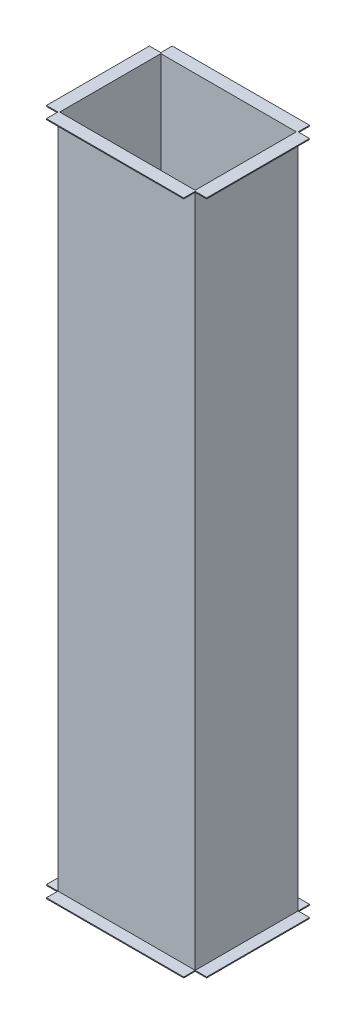
ISO-10303-21;
HEADER;
FILE_DESCRIPTION(('STEP AP214'),'2;1');
FILE_NAME('part.step','',(''),(''),'','','');
FILE_SCHEMA(('AUTOMOTIVE_DESIGN { 1 0 10303 214 1 1 1 1 }'));
ENDSEC;
DATA;
#1=APPLICATION_CONTEXT('core data for automotive mechanical design processes');
#2=APPLICATION_PROTOCOL_DEFINITION('international standard','automotive_design',2000,#1);
#3=PRODUCT_CONTEXT('',#1,'mechanical');
#4=PRODUCT('Part','Part','',(#3));
#5=PRODUCT_RELATED_PRODUCT_CATEGORY('part','',(#4));
#6=PRODUCT_DEFINITION_FORMATION('','',#4);
#7=PRODUCT_DEFINITION_CONTEXT('part definition',#1,'design');
#8=PRODUCT_DEFINITION('design','',#6,#7);
#9=PRODUCT_DEFINITION_SHAPE('','',#8);
#10=(LENGTH_UNIT() NAMED_UNIT(*) SI_UNIT(.MILLI.,.METRE.));
#11=(NAMED_UNIT(*) PLANE_ANGLE_UNIT() SI_UNIT($,.RADIAN.));
#12=(NAMED_UNIT(*) SI_UNIT($,.STERADIAN.) SOLID_ANGLE_UNIT());
#13=UNCERTAINTY_MEASURE_WITH_UNIT(LENGTH_MEASURE(1.E-05),#10,'distance_accuracy_value','');
#14=(GEOMETRIC_REPRESENTATION_CONTEXT(3) GLOBAL_UNCERTAINTY_ASSIGNED_CONTEXT((#13)) GLOBAL_UNIT_ASSIGNED_CONTEXT((#10,
#11,#12)) REPRESENTATION_CONTEXT('',''));
#15=CARTESIAN_POINT('',(0.,0.,0.));
#16=DIRECTION('',(0.,0.,1.));
#17=DIRECTION('',(1.,0.,0.));
#18=AXIS2_PLACEMENT_3D('',#15,#16,#17);
#19=CARTESIAN_POINT('',(152.4,1500.,114.3));
#20=DIRECTION('',(0.,0.,-1.));
#21=DIRECTION('',(-1.,0.,0.));
#22=AXIS2_PLACEMENT_3D('',#19,#20,#21);
#23=PLANE('',#22);
#24=DIRECTION('',(0.,-1.,0.));
#25=VECTOR('',#24,1.);
#26=CARTESIAN_POINT('',(-152.4,2.,114.3));
#27=LINE('',#26,#25);
#28=CARTESIAN_POINT('',(-152.4,2.,114.3));
#29=VERTEX_POINT('',#28);
#30=CARTESIAN_POINT('',(-152.4,0.,114.3));
#31=VERTEX_POINT('',#30);
#32=EDGE_CURVE('E322',#29,#31,#27,.T.);
#33=ORIENTED_EDGE('',*,*,#32,.F.);
#34=DIRECTION('',(-1.,0.,0.));
#35=VECTOR('',#34,1.);
#36=CARTESIAN_POINT('',(0.,2.,114.3));
#37=LINE('',#36,#35);
#38=CARTESIAN_POINT('',(-177.8,2.,114.3));
#39=VERTEX_POINT('',#38);
#40=EDGE_CURVE('E406',#29,#39,#37,.T.);
#41=ORIENTED_EDGE('',*,*,#40,.T.);
#42=DIRECTION('',(0.,-1.,0.));
#43=VECTOR('',#42,1.);
#44=CARTESIAN_POINT('',(-177.8,2.,114.3));
#45=LINE('',#44,#43);
#46=CARTESIAN_POINT('',(-177.8,0.,114.3));
#47=VERTEX_POINT('',#46);
#48=EDGE_CURVE('E413',#39,#47,#45,.T.);
#49=ORIENTED_EDGE('',*,*,#48,.T.);
#50=DIRECTION('',(1.,0.,0.));
#51=VECTOR('',#50,1.);
#52=CARTESIAN_POINT('',(152.4,0.,114.3));
#53=LINE('',#52,#51);
#54=EDGE_CURVE('E111',#47,#31,#53,.T.);
#55=ORIENTED_EDGE('',*,*,#54,.T.);
#56=EDGE_LOOP('',(#33,#41,#49,#55));
#57=FACE_BOUND('',#56,.T.);
#58=ADVANCED_FACE('F95',(#57),#23,.F.);
#59=DIRECTION('',(1.,0.,0.));
#60=VECTOR('',#59,1.);
#61=CARTESIAN_POINT('',(0.,2.,114.3));
#62=LINE('',#61,#60);
#63=CARTESIAN_POINT('',(152.4,2.,114.3));
#64=VERTEX_POINT('',#63);
#65=EDGE_CURVE('E118',#29,#64,#62,.T.);
#66=ORIENTED_EDGE('',*,*,#65,.T.);
#67=DIRECTION('',(0.,-1.,0.));
#68=VECTOR('',#67,1.);
#69=CARTESIAN_POINT('',(152.4,1500.,114.3));
#70=LINE('',#69,#68);
#71=CARTESIAN_POINT('',(152.4,1498.,114.3));
#72=VERTEX_POINT('',#71);
#73=EDGE_CURVE('E104',#72,#64,#70,.T.);
#74=ORIENTED_EDGE('',*,*,#73,.F.);
#75=DIRECTION('',(1.,0.,0.));
#76=VECTOR('',#75,1.);
#77=CARTESIAN_POINT('',(0.,1498.,114.3));
#78=LINE('',#77,#76);
#79=CARTESIAN_POINT('',(-152.4,1498.,114.3));
#80=VERTEX_POINT('',#79);
#81=EDGE_CURVE('E442',#80,#72,#78,.T.);
#82=ORIENTED_EDGE('',*,*,#81,.F.);
#83=DIRECTION('',(0.,-1.,0.));
#84=VECTOR('',#83,1.);
#85=CARTESIAN_POINT('',(-152.4,1500.,114.3));
#86=LINE('',#85,#84);
#87=EDGE_CURVE('E12',#80,#29,#86,.T.);
#88=ORIENTED_EDGE('',*,*,#87,.T.);
#89=EDGE_LOOP('',(#66,#74,#82,#88));
#90=FACE_BOUND('',#89,.T.);
#91=ADVANCED_FACE('F741',(#90),#23,.F.);
#92=CARTESIAN_POINT('',(152.4,1500.,-114.3));
#93=DIRECTION('',(-1.,0.,0.));
#94=DIRECTION('',(0.,0.,1.));
#95=AXIS2_PLACEMENT_3D('',#92,#93,#94);
#96=PLANE('',#95);
#97=DIRECTION('',(0.,0.,-1.));
#98=VECTOR('',#97,1.);
#99=CARTESIAN_POINT('',(152.4,2.,0.));
#100=LINE('',#99,#98);
#101=CARTESIAN_POINT('',(152.4,2.,-114.3));
#102=VERTEX_POINT('',#101);
#103=EDGE_CURVE('E342',#64,#102,#100,.T.);
#104=ORIENTED_EDGE('',*,*,#103,.T.);
#105=DIRECTION('',(0.,-1.,0.));
#106=VECTOR('',#105,1.);
#107=CARTESIAN_POINT('',(152.4,1500.,-114.3));
#108=LINE('',#107,#106);
#109=CARTESIAN_POINT('',(152.4,1498.,-114.3));
#110=VERTEX_POINT('',#109);
#111=EDGE_CURVE('E624',#110,#102,#108,.T.);
#112=ORIENTED_EDGE('',*,*,#111,.F.);
#113=DIRECTION('',(0.,0.,-1.));
#114=VECTOR('',#113,1.);
#115=CARTESIAN_POINT('',(152.4,1498.,0.));
#116=LINE('',#115,#114);
#117=EDGE_CURVE('E506',#72,#110,#116,.T.);
#118=ORIENTED_EDGE('',*,*,#117,.F.);
#119=ORIENTED_EDGE('',*,*,#73,.T.);
#120=EDGE_LOOP('',(#104,#112,#118,#119));
#121=FACE_BOUND('',#120,.T.);
#122=ADVANCED_FACE('F631',(#121),#96,.F.);
#123=CARTESIAN_POINT('',(152.4,1500.,-114.3));
#124=DIRECTION('',(0.,0.,1.));
#125=DIRECTION('',(1.,0.,0.));
#126=AXIS2_PLACEMENT_3D('',#123,#124,#125);
#127=PLANE('',#126);
#128=DIRECTION('',(-1.,0.,0.));
#129=VECTOR('',#128,1.);
#130=CARTESIAN_POINT('',(0.,2.,-114.3));
#131=LINE('',#130,#129);
#132=CARTESIAN_POINT('',(-152.4,2.,-114.3));
#133=VERTEX_POINT('',#132);
#134=EDGE_CURVE('E350',#102,#133,#131,.T.);
#135=ORIENTED_EDGE('',*,*,#134,.T.);
#136=DIRECTION('',(0.,-1.,0.));
#137=VECTOR('',#136,1.);
#138=CARTESIAN_POINT('',(-152.4,1500.,-114.3));
#139=LINE('',#138,#137);
#140=CARTESIAN_POINT('',(-152.4,1498.,-114.3));
#141=VERTEX_POINT('',#140);
#142=EDGE_CURVE('E613',#141,#133,#139,.T.);
#143=ORIENTED_EDGE('',*,*,#142,.F.);
#144=DIRECTION('',(-1.,0.,0.));
#145=VECTOR('',#144,1.);
#146=CARTESIAN_POINT('',(0.,1498.,-114.3));
#147=LINE('',#146,#145);
#148=EDGE_CURVE('E531',#110,#141,#147,.T.);
#149=ORIENTED_EDGE('',*,*,#148,.F.);
#150=ORIENTED_EDGE('',*,*,#111,.T.);
#151=EDGE_LOOP('',(#135,#143,#149,#150));
#152=FACE_BOUND('',#151,.T.);
#153=ADVANCED_FACE('F659',(#152),#127,.F.);
#154=CARTESIAN_POINT('',(-152.4,1500.,-114.3));
#155=DIRECTION('',(1.,0.,0.));
#156=DIRECTION('',(0.,0.,-1.));
#157=AXIS2_PLACEMENT_3D('',#154,#155,#156);
#158=PLANE('',#157);
#159=DIRECTION('',(0.,0.,1.));
#160=VECTOR('',#159,1.);
#161=CARTESIAN_POINT('',(-152.4,2.,0.));
#162=LINE('',#161,#160);
#163=EDGE_CURVE('E402',#133,#29,#162,.T.);
#164=ORIENTED_EDGE('',*,*,#163,.T.);
#165=ORIENTED_EDGE('',*,*,#87,.F.);
#166=DIRECTION('',(0.,0.,1.));
#167=VECTOR('',#166,1.);
#168=CARTESIAN_POINT('',(-152.4,1498.,0.));
#169=LINE('',#168,#167);
#170=EDGE_CURVE('E483',#141,#80,#169,.T.);
#171=ORIENTED_EDGE('',*,*,#170,.F.);
#172=ORIENTED_EDGE('',*,*,#142,.T.);
#173=EDGE_LOOP('',(#164,#165,#171,#172));
#174=FACE_BOUND('',#173,.T.);
#175=ADVANCED_FACE('F664',(#174),#158,.F.);
#176=DIRECTION('',(0.,1.,0.));
#177=VECTOR('',#176,1.);
#178=CARTESIAN_POINT('',(152.4,1498.,114.3));
#179=LINE('',#178,#177);
#180=CARTESIAN_POINT('',(152.4,1500.,114.3));
#181=VERTEX_POINT('',#180);
#182=EDGE_CURVE('E446',#72,#181,#179,.T.);
#183=ORIENTED_EDGE('',*,*,#182,.F.);
#184=DIRECTION('',(1.,0.,0.));
#185=VECTOR('',#184,1.);
#186=CARTESIAN_POINT('',(0.,1498.,114.3));
#187=LINE('',#186,#185);
#188=CARTESIAN_POINT('',(177.8,1498.,114.3));
#189=VERTEX_POINT('',#188);
#190=EDGE_CURVE('E514',#72,#189,#187,.T.);
#191=ORIENTED_EDGE('',*,*,#190,.T.);
#192=DIRECTION('',(0.,1.,0.));
#193=VECTOR('',#192,1.);
#194=CARTESIAN_POINT('',(177.8,1498.,114.3));
#195=LINE('',#194,#193);
#196=CARTESIAN_POINT('',(177.8,1500.,114.3));
#197=VERTEX_POINT('',#196);
#198=EDGE_CURVE('E518',#189,#197,#195,.T.);
#199=ORIENTED_EDGE('',*,*,#198,.T.);
#200=DIRECTION('',(1.,0.,0.));
#201=VECTOR('',#200,1.);
#202=CARTESIAN_POINT('',(152.4,1500.,114.3));
#203=LINE('',#202,#201);
#204=EDGE_CURVE('E604',#181,#197,#203,.T.);
#205=ORIENTED_EDGE('',*,*,#204,.F.);
#206=EDGE_LOOP('',(#183,#191,#199,#205));
#207=FACE_BOUND('',#206,.T.);
#208=ADVANCED_FACE('F700',(#207),#23,.F.);
#209=DIRECTION('',(1.,0.,0.));
#210=VECTOR('',#209,1.);
#211=CARTESIAN_POINT('',(0.,2.,114.3));
#212=LINE('',#211,#210);
#213=CARTESIAN_POINT('',(177.8,2.,114.3));
#214=VERTEX_POINT('',#213);
#215=EDGE_CURVE('E341',#64,#214,#212,.T.);
#216=ORIENTED_EDGE('',*,*,#215,.F.);
#217=DIRECTION('',(0.,-1.,0.));
#218=VECTOR('',#217,1.);
#219=CARTESIAN_POINT('',(152.4,2.,114.3));
#220=LINE('',#219,#218);
#221=CARTESIAN_POINT('',(152.4,0.,114.3));
#222=VERTEX_POINT('',#221);
#223=EDGE_CURVE('E308',#64,#222,#220,.T.);
#224=ORIENTED_EDGE('',*,*,#223,.T.);
#225=CARTESIAN_POINT('',(177.8,0.,114.3));
#226=VERTEX_POINT('',#225);
#227=EDGE_CURVE('E561',#222,#226,#53,.T.);
#228=ORIENTED_EDGE('',*,*,#227,.T.);
#229=DIRECTION('',(0.,-1.,0.));
#230=VECTOR('',#229,1.);
#231=CARTESIAN_POINT('',(177.8,2.,114.3));
#232=LINE('',#231,#230);
#233=EDGE_CURVE('E332',#214,#226,#232,.T.);
#234=ORIENTED_EDGE('',*,*,#233,.F.);
#235=EDGE_LOOP('',(#216,#224,#228,#234));
#236=FACE_BOUND('',#235,.T.);
#237=ADVANCED_FACE('F638',(#236),#23,.F.);
#238=DIRECTION('',(0.,1.,0.));
#239=VECTOR('',#238,1.);
#240=CARTESIAN_POINT('',(152.4,1498.,-114.3));
#241=LINE('',#240,#239);
#242=CARTESIAN_POINT('',(152.4,1500.,-114.3));
#243=VERTEX_POINT('',#242);
#244=EDGE_CURVE('E498',#110,#243,#241,.T.);
#245=ORIENTED_EDGE('',*,*,#244,.F.);
#246=DIRECTION('',(0.,0.,-1.));
#247=VECTOR('',#246,1.);
#248=CARTESIAN_POINT('',(152.4,1498.,3.33066907387547E-13));
#249=LINE('',#248,#247);
#250=CARTESIAN_POINT('',(152.4,1498.,-139.7));
#251=VERTEX_POINT('',#250);
#252=EDGE_CURVE('E535',#110,#251,#249,.T.);
#253=ORIENTED_EDGE('',*,*,#252,.T.);
#254=DIRECTION('',(0.,1.,0.));
#255=VECTOR('',#254,1.);
#256=CARTESIAN_POINT('',(152.4,1498.,-139.7));
#257=LINE('',#256,#255);
#258=CARTESIAN_POINT('',(152.4,1500.,-139.7));
#259=VERTEX_POINT('',#258);
#260=EDGE_CURVE('E545',#251,#259,#257,.T.);
#261=ORIENTED_EDGE('',*,*,#260,.T.);
#262=DIRECTION('',(0.,0.,-1.));
#263=VECTOR('',#262,1.);
#264=CARTESIAN_POINT('',(152.4,1500.,-114.3));
#265=LINE('',#264,#263);
#266=EDGE_CURVE('E610',#243,#259,#265,.T.);
#267=ORIENTED_EDGE('',*,*,#266,.F.);
#268=EDGE_LOOP('',(#245,#253,#261,#267));
#269=FACE_BOUND('',#268,.T.);
#270=ADVANCED_FACE('F712',(#269),#96,.F.);
#271=DIRECTION('',(0.,0.,-1.));
#272=VECTOR('',#271,1.);
#273=CARTESIAN_POINT('',(152.4,2.,3.33066907387547E-13));
#274=LINE('',#273,#272);
#275=CARTESIAN_POINT('',(152.4,2.,-139.7));
#276=VERTEX_POINT('',#275);
#277=EDGE_CURVE('E373',#102,#276,#274,.T.);
#278=ORIENTED_EDGE('',*,*,#277,.F.);
#279=DIRECTION('',(0.,-1.,0.));
#280=VECTOR('',#279,1.);
#281=CARTESIAN_POINT('',(152.4,2.,-114.3));
#282=LINE('',#281,#280);
#283=CARTESIAN_POINT('',(152.4,0.,-114.3));
#284=VERTEX_POINT('',#283);
#285=EDGE_CURVE('E337',#102,#284,#282,.T.);
#286=ORIENTED_EDGE('',*,*,#285,.T.);
#287=DIRECTION('',(0.,0.,-1.));
#288=VECTOR('',#287,1.);
#289=CARTESIAN_POINT('',(152.4,0.,-114.3));
#290=LINE('',#289,#288);
#291=CARTESIAN_POINT('',(152.4,0.,-139.7));
#292=VERTEX_POINT('',#291);
#293=EDGE_CURVE('E616',#284,#292,#290,.T.);
#294=ORIENTED_EDGE('',*,*,#293,.T.);
#295=DIRECTION('',(0.,-1.,0.));
#296=VECTOR('',#295,1.);
#297=CARTESIAN_POINT('',(152.4,2.,-139.7));
#298=LINE('',#297,#296);
#299=EDGE_CURVE('E375',#276,#292,#298,.T.);
#300=ORIENTED_EDGE('',*,*,#299,.F.);
#301=EDGE_LOOP('',(#278,#286,#294,#300));
#302=FACE_BOUND('',#301,.T.);
#303=ADVANCED_FACE('F650',(#302),#96,.F.);
#304=DIRECTION('',(-1.,0.,0.));
#305=VECTOR('',#304,1.);
#306=CARTESIAN_POINT('',(0.,2.,-114.3));
#307=LINE('',#306,#305);
#308=CARTESIAN_POINT('',(-177.8,2.,-114.3));
#309=VERTEX_POINT('',#308);
#310=EDGE_CURVE('E398',#133,#309,#307,.T.);
#311=ORIENTED_EDGE('',*,*,#310,.F.);
#312=DIRECTION('',(0.,-1.,0.));
#313=VECTOR('',#312,1.);
#314=CARTESIAN_POINT('',(-152.4,2.,-114.3));
#315=LINE('',#314,#313);
#316=CARTESIAN_POINT('',(-152.4,0.,-114.3));
#317=VERTEX_POINT('',#316);
#318=EDGE_CURVE('E365',#133,#317,#315,.T.);
#319=ORIENTED_EDGE('',*,*,#318,.T.);
#320=DIRECTION('',(-1.,0.,0.));
#321=VECTOR('',#320,1.);
#322=CARTESIAN_POINT('',(152.4,0.,-114.3));
#323=LINE('',#322,#321);
#324=CARTESIAN_POINT('',(-177.8,0.,-114.3));
#325=VERTEX_POINT('',#324);
#326=EDGE_CURVE('E605',#317,#325,#323,.T.);
#327=ORIENTED_EDGE('',*,*,#326,.T.);
#328=DIRECTION('',(0.,-1.,0.));
#329=VECTOR('',#328,1.);
#330=CARTESIAN_POINT('',(-177.8,2.,-114.3));
#331=LINE('',#330,#329);
#332=EDGE_CURVE('E417',#309,#325,#331,.T.);
#333=ORIENTED_EDGE('',*,*,#332,.F.);
#334=EDGE_LOOP('',(#311,#319,#327,#333));
#335=FACE_BOUND('',#334,.T.);
#336=ADVANCED_FACE('F669',(#335),#127,.F.);
#337=CARTESIAN_POINT('',(0.,1500.,0.));
#338=DIRECTION('',(0.,-1.,0.));
#339=DIRECTION('',(0.,0.,-1.));
#340=AXIS2_PLACEMENT_3D('',#337,#338,#339);
#341=PLANE('',#340);
#342=DIRECTION('',(0.,0.,1.));
#343=VECTOR('',#342,1.);
#344=CARTESIAN_POINT('',(-152.4,1500.,-114.3));
#345=LINE('',#344,#343);
#346=CARTESIAN_POINT('',(-152.4,1500.,-139.7));
#347=VERTEX_POINT('',#346);
#348=CARTESIAN_POINT('',(-152.4,1500.,-114.3));
#349=VERTEX_POINT('',#348);
#350=EDGE_CURVE('E600',#347,#349,#345,.T.);
#351=ORIENTED_EDGE('',*,*,#350,.T.);
#352=DIRECTION('',(-1.,0.,0.));
#353=VECTOR('',#352,1.);
#354=CARTESIAN_POINT('',(0.,1500.,-114.3));
#355=LINE('',#354,#353);
#356=CARTESIAN_POINT('',(-177.8,1500.,-114.3));
#357=VERTEX_POINT('',#356);
#358=EDGE_CURVE('E437',#349,#357,#355,.T.);
#359=ORIENTED_EDGE('',*,*,#358,.T.);
#360=DIRECTION('',(0.,0.,1.));
#361=VECTOR('',#360,1.);
#362=CARTESIAN_POINT('',(-177.8,1500.,0.));
#363=LINE('',#362,#361);
#364=CARTESIAN_POINT('',(-177.8,1500.,114.3));
#365=VERTEX_POINT('',#364);
#366=EDGE_CURVE('E469',#357,#365,#363,.T.);
#367=ORIENTED_EDGE('',*,*,#366,.T.);
#368=CARTESIAN_POINT('',(-152.4,1500.,114.3));
#369=VERTEX_POINT('',#368);
#370=EDGE_CURVE('E606',#365,#369,#203,.T.);
#371=ORIENTED_EDGE('',*,*,#370,.T.);
#372=DIRECTION('',(0.,0.,1.));
#373=VECTOR('',#372,1.);
#374=CARTESIAN_POINT('',(-152.4,1500.,-3.33066907387547E-13));
#375=LINE('',#374,#373);
#376=CARTESIAN_POINT('',(-152.4,1500.,139.7));
#377=VERTEX_POINT('',#376);
#378=EDGE_CURVE('E438',#369,#377,#375,.T.);
#379=ORIENTED_EDGE('',*,*,#378,.T.);
#380=DIRECTION('',(1.,0.,0.));
#381=VECTOR('',#380,1.);
#382=CARTESIAN_POINT('',(0.,1500.,139.7));
#383=LINE('',#382,#381);
#384=CARTESIAN_POINT('',(152.4,1500.,139.7));
#385=VERTEX_POINT('',#384);
#386=EDGE_CURVE('E433',#377,#385,#383,.T.);
#387=ORIENTED_EDGE('',*,*,#386,.T.);
#388=DIRECTION('',(0.,0.,1.));
#389=VECTOR('',#388,1.);
#390=CARTESIAN_POINT('',(152.4,1500.,0.));
#391=LINE('',#390,#389);
#392=EDGE_CURVE('E421',#181,#385,#391,.T.);
#393=ORIENTED_EDGE('',*,*,#392,.F.);
#394=ORIENTED_EDGE('',*,*,#204,.T.);
#395=DIRECTION('',(0.,0.,1.));
#396=VECTOR('',#395,1.);
#397=CARTESIAN_POINT('',(177.8,1500.,0.));
#398=LINE('',#397,#396);
#399=CARTESIAN_POINT('',(177.8,1500.,-114.3));
#400=VERTEX_POINT('',#399);
#401=EDGE_CURVE('E482',#400,#197,#398,.T.);
#402=ORIENTED_EDGE('',*,*,#401,.F.);
#403=DIRECTION('',(1.,0.,0.));
#404=VECTOR('',#403,1.);
#405=CARTESIAN_POINT('',(1.87350135405495E-13,1500.,-114.3));
#406=LINE('',#405,#404);
#407=EDGE_CURVE('E503',#243,#400,#406,.T.);
#408=ORIENTED_EDGE('',*,*,#407,.F.);
#409=ORIENTED_EDGE('',*,*,#266,.T.);
#410=DIRECTION('',(1.,0.,0.));
#411=VECTOR('',#410,1.);
#412=CARTESIAN_POINT('',(0.,1500.,-139.7));
#413=LINE('',#412,#411);
#414=EDGE_CURVE('E510',#347,#259,#413,.T.);
#415=ORIENTED_EDGE('',*,*,#414,.F.);
#416=EDGE_LOOP('',(#351,#359,#367,#371,#379,#387,#393,#394,#402,#408,#409,#415));
#417=FACE_BOUND('',#416,.T.);
#418=DIRECTION('',(0.,0.,1.));
#419=VECTOR('',#418,1.);
#420=CARTESIAN_POINT('',(-150.4,1500.,0.));
#421=LINE('',#420,#419);
#422=CARTESIAN_POINT('',(-150.4,1500.,-112.3));
#423=VERTEX_POINT('',#422);
#424=CARTESIAN_POINT('',(-150.4,1500.,112.3));
#425=VERTEX_POINT('',#424);
#426=EDGE_CURVE('E581',#423,#425,#421,.T.);
#427=ORIENTED_EDGE('',*,*,#426,.F.);
#428=DIRECTION('',(-1.,0.,0.));
#429=VECTOR('',#428,1.);
#430=CARTESIAN_POINT('',(0.,1500.,-112.3));
#431=LINE('',#430,#429);
#432=CARTESIAN_POINT('',(150.4,1500.,-112.3));
#433=VERTEX_POINT('',#432);
#434=EDGE_CURVE('E567',#433,#423,#431,.T.);
#435=ORIENTED_EDGE('',*,*,#434,.F.);
#436=DIRECTION('',(0.,0.,-1.));
#437=VECTOR('',#436,1.);
#438=CARTESIAN_POINT('',(150.4,1500.,0.));
#439=LINE('',#438,#437);
#440=CARTESIAN_POINT('',(150.4,1500.,112.3));
#441=VERTEX_POINT('',#440);
#442=EDGE_CURVE('E594',#441,#433,#439,.T.);
#443=ORIENTED_EDGE('',*,*,#442,.F.);
#444=DIRECTION('',(1.,0.,0.));
#445=VECTOR('',#444,1.);
#446=CARTESIAN_POINT('',(0.,1500.,112.3));
#447=LINE('',#446,#445);
#448=EDGE_CURVE('E591',#425,#441,#447,.T.);
#449=ORIENTED_EDGE('',*,*,#448,.F.);
#450=EDGE_LOOP('',(#427,#435,#443,#449));
#451=FACE_BOUND('',#450,.T.);
#452=ADVANCED_FACE('F694',(#417,#451),#341,.F.);
#453=CARTESIAN_POINT('',(0.,0.,0.));
#454=DIRECTION('',(0.,-1.,0.));
#455=DIRECTION('',(0.,0.,-1.));
#456=AXIS2_PLACEMENT_3D('',#453,#454,#455);
#457=PLANE('',#456);
#458=ORIENTED_EDGE('',*,*,#54,.F.);
#459=DIRECTION('',(0.,0.,1.));
#460=VECTOR('',#459,1.);
#461=CARTESIAN_POINT('',(-177.8,0.,0.));
#462=LINE('',#461,#460);
#463=EDGE_CURVE('E383',#325,#47,#462,.T.);
#464=ORIENTED_EDGE('',*,*,#463,.F.);
#465=ORIENTED_EDGE('',*,*,#326,.F.);
#466=DIRECTION('',(0.,0.,-1.));
#467=VECTOR('',#466,1.);
#468=CARTESIAN_POINT('',(-152.4,0.,0.));
#469=LINE('',#468,#467);
#470=CARTESIAN_POINT('',(-152.4,0.,-139.7));
#471=VERTEX_POINT('',#470);
#472=EDGE_CURVE('E384',#317,#471,#469,.T.);
#473=ORIENTED_EDGE('',*,*,#472,.T.);
#474=DIRECTION('',(1.,0.,0.));
#475=VECTOR('',#474,1.);
#476=CARTESIAN_POINT('',(0.,0.,-139.7));
#477=LINE('',#476,#475);
#478=EDGE_CURVE('E379',#471,#292,#477,.T.);
#479=ORIENTED_EDGE('',*,*,#478,.T.);
#480=ORIENTED_EDGE('',*,*,#293,.F.);
#481=DIRECTION('',(1.,0.,0.));
#482=VECTOR('',#481,1.);
#483=CARTESIAN_POINT('',(1.87350135405495E-13,0.,-114.3));
#484=LINE('',#483,#482);
#485=CARTESIAN_POINT('',(177.8,0.,-114.3));
#486=VERTEX_POINT('',#485);
#487=EDGE_CURVE('E346',#284,#486,#484,.T.);
#488=ORIENTED_EDGE('',*,*,#487,.T.);
#489=DIRECTION('',(0.,0.,1.));
#490=VECTOR('',#489,1.);
#491=CARTESIAN_POINT('',(177.8,0.,0.));
#492=LINE('',#491,#490);
#493=EDGE_CURVE('E351',#486,#226,#492,.T.);
#494=ORIENTED_EDGE('',*,*,#493,.T.);
#495=ORIENTED_EDGE('',*,*,#227,.F.);
#496=DIRECTION('',(0.,0.,1.));
#497=VECTOR('',#496,1.);
#498=CARTESIAN_POINT('',(152.4,0.,0.));
#499=LINE('',#498,#497);
#500=CARTESIAN_POINT('',(152.4,0.,139.7));
#501=VERTEX_POINT('',#500);
#502=EDGE_CURVE('E293',#222,#501,#499,.T.);
#503=ORIENTED_EDGE('',*,*,#502,.T.);
#504=DIRECTION('',(1.,0.,0.));
#505=VECTOR('',#504,1.);
#506=CARTESIAN_POINT('',(0.,0.,139.7));
#507=LINE('',#506,#505);
#508=CARTESIAN_POINT('',(-152.4,0.,139.7));
#509=VERTEX_POINT('',#508);
#510=EDGE_CURVE('E299',#509,#501,#507,.T.);
#511=ORIENTED_EDGE('',*,*,#510,.F.);
#512=DIRECTION('',(0.,0.,1.));
#513=VECTOR('',#512,1.);
#514=CARTESIAN_POINT('',(-152.4,0.,-3.33066907387547E-13));
#515=LINE('',#514,#513);
#516=EDGE_CURVE('E323',#31,#509,#515,.T.);
#517=ORIENTED_EDGE('',*,*,#516,.F.);
#518=EDGE_LOOP('',(#458,#464,#465,#473,#479,#480,#488,#494,#495,#503,#511,#517));
#519=FACE_BOUND('',#518,.T.);
#520=DIRECTION('',(-1.,0.,0.));
#521=VECTOR('',#520,1.);
#522=CARTESIAN_POINT('',(0.,0.,-112.3));
#523=LINE('',#522,#521);
#524=CARTESIAN_POINT('',(150.4,0.,-112.3));
#525=VERTEX_POINT('',#524);
#526=CARTESIAN_POINT('',(-150.4,0.,-112.3));
#527=VERTEX_POINT('',#526);
#528=EDGE_CURVE('E577',#525,#527,#523,.T.);
#529=ORIENTED_EDGE('',*,*,#528,.T.);
#530=DIRECTION('',(0.,0.,1.));
#531=VECTOR('',#530,1.);
#532=CARTESIAN_POINT('',(-150.4,0.,0.));
#533=LINE('',#532,#531);
#534=CARTESIAN_POINT('',(-150.4,0.,112.3));
#535=VERTEX_POINT('',#534);
#536=EDGE_CURVE('E553',#527,#535,#533,.T.);
#537=ORIENTED_EDGE('',*,*,#536,.T.);
#538=DIRECTION('',(1.,0.,0.));
#539=VECTOR('',#538,1.);
#540=CARTESIAN_POINT('',(0.,0.,112.3));
#541=LINE('',#540,#539);
#542=CARTESIAN_POINT('',(150.4,0.,112.3));
#543=VERTEX_POINT('',#542);
#544=EDGE_CURVE('E576',#535,#543,#541,.T.);
#545=ORIENTED_EDGE('',*,*,#544,.T.);
#546=DIRECTION('',(0.,0.,-1.));
#547=VECTOR('',#546,1.);
#548=CARTESIAN_POINT('',(150.4,0.,0.));
#549=LINE('',#548,#547);
#550=EDGE_CURVE('E582',#543,#525,#549,.T.);
#551=ORIENTED_EDGE('',*,*,#550,.T.);
#552=EDGE_LOOP('',(#529,#537,#545,#551));
#553=FACE_BOUND('',#552,.T.);
#554=ADVANCED_FACE('F679',(#519,#553),#457,.T.);
#555=DIRECTION('',(0.,0.,-1.));
#556=VECTOR('',#555,1.);
#557=CARTESIAN_POINT('',(-152.4,1498.,0.));
#558=LINE('',#557,#556);
#559=CARTESIAN_POINT('',(-152.4,1498.,-139.7));
#560=VERTEX_POINT('',#559);
#561=EDGE_CURVE('E542',#141,#560,#558,.T.);
#562=ORIENTED_EDGE('',*,*,#561,.F.);
#563=DIRECTION('',(0.,1.,0.));
#564=VECTOR('',#563,1.);
#565=CARTESIAN_POINT('',(-152.4,1498.,-114.3));
#566=LINE('',#565,#564);
#567=EDGE_CURVE('E464',#141,#349,#566,.T.);
#568=ORIENTED_EDGE('',*,*,#567,.T.);
#569=ORIENTED_EDGE('',*,*,#350,.F.);
#570=DIRECTION('',(0.,1.,0.));
#571=VECTOR('',#570,1.);
#572=CARTESIAN_POINT('',(-152.4,1498.,-139.7));
#573=LINE('',#572,#571);
#574=EDGE_CURVE('E549',#560,#347,#573,.T.);
#575=ORIENTED_EDGE('',*,*,#574,.F.);
#576=EDGE_LOOP('',(#562,#568,#569,#575));
#577=FACE_BOUND('',#576,.T.);
#578=ADVANCED_FACE('F97',(#577),#158,.F.);
#579=DIRECTION('',(-1.,0.,0.));
#580=VECTOR('',#579,1.);
#581=CARTESIAN_POINT('',(0.,1498.,114.3));
#582=LINE('',#581,#580);
#583=CARTESIAN_POINT('',(-177.8,1498.,114.3));
#584=VERTEX_POINT('',#583);
#585=EDGE_CURVE('E479',#80,#584,#582,.T.);
#586=ORIENTED_EDGE('',*,*,#585,.F.);
#587=DIRECTION('',(0.,1.,0.));
#588=VECTOR('',#587,1.);
#589=CARTESIAN_POINT('',(-152.4,1498.,114.3));
#590=LINE('',#589,#588);
#591=EDGE_CURVE('E427',#80,#369,#590,.T.);
#592=ORIENTED_EDGE('',*,*,#591,.T.);
#593=ORIENTED_EDGE('',*,*,#370,.F.);
#594=DIRECTION('',(0.,1.,0.));
#595=VECTOR('',#594,1.);
#596=CARTESIAN_POINT('',(-177.8,1498.,114.3));
#597=LINE('',#596,#595);
#598=EDGE_CURVE('E475',#584,#365,#597,.T.);
#599=ORIENTED_EDGE('',*,*,#598,.F.);
#600=EDGE_LOOP('',(#586,#592,#593,#599));
#601=FACE_BOUND('',#600,.T.);
#602=ADVANCED_FACE('F729',(#601),#23,.F.);
#603=CARTESIAN_POINT('',(-150.4,1500.,-114.3));
#604=DIRECTION('',(1.,0.,0.));
#605=DIRECTION('',(0.,0.,-1.));
#606=AXIS2_PLACEMENT_3D('',#603,#604,#605);
#607=PLANE('',#606);
#608=ORIENTED_EDGE('',*,*,#536,.F.);
#609=DIRECTION('',(0.,-1.,0.));
#610=VECTOR('',#609,1.);
#611=CARTESIAN_POINT('',(-150.4,1500.,-112.3));
#612=LINE('',#611,#610);
#613=EDGE_CURVE('E563',#423,#527,#612,.T.);
#614=ORIENTED_EDGE('',*,*,#613,.F.);
#615=ORIENTED_EDGE('',*,*,#426,.T.);
#616=DIRECTION('',(0.,-1.,0.));
#617=VECTOR('',#616,1.);
#618=CARTESIAN_POINT('',(-150.4,1500.,112.3));
#619=LINE('',#618,#617);
#620=EDGE_CURVE('E557',#425,#535,#619,.T.);
#621=ORIENTED_EDGE('',*,*,#620,.T.);
#622=EDGE_LOOP('',(#608,#614,#615,#621));
#623=FACE_BOUND('',#622,.T.);
#624=ADVANCED_FACE('F764',(#623),#607,.T.);
#625=CARTESIAN_POINT('',(152.4,1500.,112.3));
#626=DIRECTION('',(0.,0.,-1.));
#627=DIRECTION('',(-1.,0.,0.));
#628=AXIS2_PLACEMENT_3D('',#625,#626,#627);
#629=PLANE('',#628);
#630=ORIENTED_EDGE('',*,*,#544,.F.);
#631=ORIENTED_EDGE('',*,*,#620,.F.);
#632=ORIENTED_EDGE('',*,*,#448,.T.);
#633=DIRECTION('',(0.,-1.,0.));
#634=VECTOR('',#633,1.);
#635=CARTESIAN_POINT('',(150.4,1500.,112.3));
#636=LINE('',#635,#634);
#637=EDGE_CURVE('E562',#441,#543,#636,.T.);
#638=ORIENTED_EDGE('',*,*,#637,.T.);
#639=EDGE_LOOP('',(#630,#631,#632,#638));
#640=FACE_BOUND('',#639,.T.);
#641=ADVANCED_FACE('F934',(#640),#629,.T.);
#642=CARTESIAN_POINT('',(150.4,1500.,-114.3));
#643=DIRECTION('',(-1.,0.,0.));
#644=DIRECTION('',(0.,0.,1.));
#645=AXIS2_PLACEMENT_3D('',#642,#643,#644);
#646=PLANE('',#645);
#647=ORIENTED_EDGE('',*,*,#550,.F.);
#648=ORIENTED_EDGE('',*,*,#637,.F.);
#649=ORIENTED_EDGE('',*,*,#442,.T.);
#650=DIRECTION('',(0.,-1.,0.));
#651=VECTOR('',#650,1.);
#652=CARTESIAN_POINT('',(150.4,1500.,-112.3));
#653=LINE('',#652,#651);
#654=EDGE_CURVE('E566',#433,#525,#653,.T.);
#655=ORIENTED_EDGE('',*,*,#654,.T.);
#656=EDGE_LOOP('',(#647,#648,#649,#655));
#657=FACE_BOUND('',#656,.T.);
#658=ADVANCED_FACE('F938',(#657),#646,.T.);
#659=CARTESIAN_POINT('',(152.4,1500.,-112.3));
#660=DIRECTION('',(0.,0.,1.));
#661=DIRECTION('',(1.,0.,0.));
#662=AXIS2_PLACEMENT_3D('',#659,#660,#661);
#663=PLANE('',#662);
#664=ORIENTED_EDGE('',*,*,#528,.F.);
#665=ORIENTED_EDGE('',*,*,#654,.F.);
#666=ORIENTED_EDGE('',*,*,#434,.T.);
#667=ORIENTED_EDGE('',*,*,#613,.T.);
#668=EDGE_LOOP('',(#664,#665,#666,#667));
#669=FACE_BOUND('',#668,.T.);
#670=ADVANCED_FACE('F929',(#669),#663,.T.);
#671=CARTESIAN_POINT('',(0.,1498.,-139.7));
#672=DIRECTION('',(0.,0.,1.));
#673=DIRECTION('',(1.,0.,0.));
#674=AXIS2_PLACEMENT_3D('',#671,#672,#673);
#675=PLANE('',#674);
#676=ORIENTED_EDGE('',*,*,#414,.T.);
#677=ORIENTED_EDGE('',*,*,#260,.F.);
#678=DIRECTION('',(1.,0.,0.));
#679=VECTOR('',#678,1.);
#680=CARTESIAN_POINT('',(0.,1498.,-139.7));
#681=LINE('',#680,#679);
#682=EDGE_CURVE('E539',#560,#251,#681,.T.);
#683=ORIENTED_EDGE('',*,*,#682,.F.);
#684=ORIENTED_EDGE('',*,*,#574,.T.);
#685=EDGE_LOOP('',(#676,#677,#683,#684));
#686=FACE_BOUND('',#685,.T.);
#687=ADVANCED_FACE('F715',(#686),#675,.F.);
#688=CARTESIAN_POINT('',(0.,1498.,0.));
#689=DIRECTION('',(0.,1.,0.));
#690=DIRECTION('',(0.,0.,1.));
#691=AXIS2_PLACEMENT_3D('',#688,#689,#690);
#692=PLANE('',#691);
#693=ORIENTED_EDGE('',*,*,#148,.T.);
#694=ORIENTED_EDGE('',*,*,#561,.T.);
#695=ORIENTED_EDGE('',*,*,#682,.T.);
#696=ORIENTED_EDGE('',*,*,#252,.F.);
#697=EDGE_LOOP('',(#693,#694,#695,#696));
#698=FACE_BOUND('',#697,.T.);
#699=ADVANCED_FACE('F925',(#698),#692,.F.);
#700=CARTESIAN_POINT('',(177.8,1498.,0.));
#701=DIRECTION('',(-1.,0.,0.));
#702=DIRECTION('',(0.,0.,1.));
#703=AXIS2_PLACEMENT_3D('',#700,#701,#702);
#704=PLANE('',#703);
#705=ORIENTED_EDGE('',*,*,#401,.T.);
#706=ORIENTED_EDGE('',*,*,#198,.F.);
#707=DIRECTION('',(0.,0.,1.));
#708=VECTOR('',#707,1.);
#709=CARTESIAN_POINT('',(177.8,1498.,0.));
#710=LINE('',#709,#708);
#711=CARTESIAN_POINT('',(177.8,1498.,-114.3));
#712=VERTEX_POINT('',#711);
#713=EDGE_CURVE('E502',#712,#189,#710,.T.);
#714=ORIENTED_EDGE('',*,*,#713,.F.);
#715=DIRECTION('',(0.,1.,0.));
#716=VECTOR('',#715,1.);
#717=CARTESIAN_POINT('',(177.8,1498.,-114.3));
#718=LINE('',#717,#716);
#719=EDGE_CURVE('E519',#712,#400,#718,.T.);
#720=ORIENTED_EDGE('',*,*,#719,.T.);
#721=EDGE_LOOP('',(#705,#706,#714,#720));
#722=FACE_BOUND('',#721,.T.);
#723=ADVANCED_FACE('F703',(#722),#704,.F.);
#724=CARTESIAN_POINT('',(1.87350135405495E-13,1498.,-114.3));
#725=DIRECTION('',(0.,0.,1.));
#726=DIRECTION('',(1.,0.,0.));
#727=AXIS2_PLACEMENT_3D('',#724,#725,#726);
#728=PLANE('',#727);
#729=ORIENTED_EDGE('',*,*,#407,.T.);
#730=ORIENTED_EDGE('',*,*,#719,.F.);
#731=DIRECTION('',(1.,0.,0.));
#732=VECTOR('',#731,1.);
#733=CARTESIAN_POINT('',(1.87350135405495E-13,1498.,-114.3));
#734=LINE('',#733,#732);
#735=EDGE_CURVE('E507',#110,#712,#734,.T.);
#736=ORIENTED_EDGE('',*,*,#735,.F.);
#737=ORIENTED_EDGE('',*,*,#244,.T.);
#738=EDGE_LOOP('',(#729,#730,#736,#737));
#739=FACE_BOUND('',#738,.T.);
#740=ADVANCED_FACE('F707',(#739),#728,.F.);
#741=CARTESIAN_POINT('',(0.,1498.,0.));
#742=DIRECTION('',(0.,1.,0.));
#743=DIRECTION('',(0.,0.,1.));
#744=AXIS2_PLACEMENT_3D('',#741,#742,#743);
#745=PLANE('',#744);
#746=ORIENTED_EDGE('',*,*,#713,.T.);
#747=ORIENTED_EDGE('',*,*,#190,.F.);
#748=ORIENTED_EDGE('',*,*,#117,.T.);
#749=ORIENTED_EDGE('',*,*,#735,.T.);
#750=EDGE_LOOP('',(#746,#747,#748,#749));
#751=FACE_BOUND('',#750,.T.);
#752=ADVANCED_FACE('F913',(#751),#745,.F.);
#753=CARTESIAN_POINT('',(-177.8,1498.,0.));
#754=DIRECTION('',(-1.,0.,0.));
#755=DIRECTION('',(0.,0.,1.));
#756=AXIS2_PLACEMENT_3D('',#753,#754,#755);
#757=PLANE('',#756);
#758=ORIENTED_EDGE('',*,*,#366,.F.);
#759=DIRECTION('',(0.,1.,0.));
#760=VECTOR('',#759,1.);
#761=CARTESIAN_POINT('',(-177.8,1498.,-114.3));
#762=LINE('',#761,#760);
#763=CARTESIAN_POINT('',(-177.8,1498.,-114.3));
#764=VERTEX_POINT('',#763);
#765=EDGE_CURVE('E474',#764,#357,#762,.T.);
#766=ORIENTED_EDGE('',*,*,#765,.F.);
#767=DIRECTION('',(0.,0.,1.));
#768=VECTOR('',#767,1.);
#769=CARTESIAN_POINT('',(-177.8,1498.,0.));
#770=LINE('',#769,#768);
#771=EDGE_CURVE('E468',#764,#584,#770,.T.);
#772=ORIENTED_EDGE('',*,*,#771,.T.);
#773=ORIENTED_EDGE('',*,*,#598,.T.);
#774=EDGE_LOOP('',(#758,#766,#772,#773));
#775=FACE_BOUND('',#774,.T.);
#776=ADVANCED_FACE('F725',(#775),#757,.T.);
#777=CARTESIAN_POINT('',(0.,1498.,-114.3));
#778=DIRECTION('',(0.,0.,-1.));
#779=DIRECTION('',(-1.,0.,0.));
#780=AXIS2_PLACEMENT_3D('',#777,#778,#779);
#781=PLANE('',#780);
#782=ORIENTED_EDGE('',*,*,#358,.F.);
#783=ORIENTED_EDGE('',*,*,#567,.F.);
#784=DIRECTION('',(-1.,0.,0.));
#785=VECTOR('',#784,1.);
#786=CARTESIAN_POINT('',(0.,1498.,-114.3));
#787=LINE('',#786,#785);
#788=EDGE_CURVE('E470',#141,#764,#787,.T.);
#789=ORIENTED_EDGE('',*,*,#788,.T.);
#790=ORIENTED_EDGE('',*,*,#765,.T.);
#791=EDGE_LOOP('',(#782,#783,#789,#790));
#792=FACE_BOUND('',#791,.T.);
#793=ADVANCED_FACE('F722',(#792),#781,.T.);
#794=CARTESIAN_POINT('',(0.,1498.,0.));
#795=DIRECTION('',(0.,1.,0.));
#796=DIRECTION('',(0.,0.,1.));
#797=AXIS2_PLACEMENT_3D('',#794,#795,#796);
#798=PLANE('',#797);
#799=ORIENTED_EDGE('',*,*,#788,.F.);
#800=ORIENTED_EDGE('',*,*,#170,.T.);
#801=ORIENTED_EDGE('',*,*,#585,.T.);
#802=ORIENTED_EDGE('',*,*,#771,.F.);
#803=EDGE_LOOP('',(#799,#800,#801,#802));
#804=FACE_BOUND('',#803,.T.);
#805=ADVANCED_FACE('F903',(#804),#798,.F.);
#806=CARTESIAN_POINT('',(152.4,1498.,0.));
#807=DIRECTION('',(-1.,0.,0.));
#808=DIRECTION('',(0.,0.,1.));
#809=AXIS2_PLACEMENT_3D('',#806,#807,#808);
#810=PLANE('',#809);
#811=ORIENTED_EDGE('',*,*,#392,.T.);
#812=DIRECTION('',(0.,1.,0.));
#813=VECTOR('',#812,1.);
#814=CARTESIAN_POINT('',(152.4,1498.,139.7));
#815=LINE('',#814,#813);
#816=CARTESIAN_POINT('',(152.4,1498.,139.7));
#817=VERTEX_POINT('',#816);
#818=EDGE_CURVE('E429',#817,#385,#815,.T.);
#819=ORIENTED_EDGE('',*,*,#818,.F.);
#820=DIRECTION('',(0.,0.,1.));
#821=VECTOR('',#820,1.);
#822=CARTESIAN_POINT('',(152.4,1498.,0.));
#823=LINE('',#822,#821);
#824=EDGE_CURVE('E456',#72,#817,#823,.T.);
#825=ORIENTED_EDGE('',*,*,#824,.F.);
#826=ORIENTED_EDGE('',*,*,#182,.T.);
#827=EDGE_LOOP('',(#811,#819,#825,#826));
#828=FACE_BOUND('',#827,.T.);
#829=ADVANCED_FACE('F737',(#828),#810,.F.);
#830=CARTESIAN_POINT('',(0.,1498.,139.7));
#831=DIRECTION('',(0.,0.,1.));
#832=DIRECTION('',(1.,0.,0.));
#833=AXIS2_PLACEMENT_3D('',#830,#831,#832);
#834=PLANE('',#833);
#835=ORIENTED_EDGE('',*,*,#386,.F.);
#836=DIRECTION('',(0.,1.,0.));
#837=VECTOR('',#836,1.);
#838=CARTESIAN_POINT('',(-152.4,1498.,139.7));
#839=LINE('',#838,#837);
#840=CARTESIAN_POINT('',(-152.4,1498.,139.7));
#841=VERTEX_POINT('',#840);
#842=EDGE_CURVE('E424',#841,#377,#839,.T.);
#843=ORIENTED_EDGE('',*,*,#842,.F.);
#844=DIRECTION('',(1.,0.,0.));
#845=VECTOR('',#844,1.);
#846=CARTESIAN_POINT('',(0.,1498.,139.7));
#847=LINE('',#846,#845);
#848=EDGE_CURVE('E432',#841,#817,#847,.T.);
#849=ORIENTED_EDGE('',*,*,#848,.T.);
#850=ORIENTED_EDGE('',*,*,#818,.T.);
#851=EDGE_LOOP('',(#835,#843,#849,#850));
#852=FACE_BOUND('',#851,.T.);
#853=ADVANCED_FACE('F733',(#852),#834,.T.);
#854=CARTESIAN_POINT('',(-152.4,1498.,-3.33066907387547E-13));
#855=DIRECTION('',(-1.,0.,0.));
#856=DIRECTION('',(0.,0.,1.));
#857=AXIS2_PLACEMENT_3D('',#854,#855,#856);
#858=PLANE('',#857);
#859=ORIENTED_EDGE('',*,*,#378,.F.);
#860=ORIENTED_EDGE('',*,*,#591,.F.);
#861=DIRECTION('',(0.,0.,1.));
#862=VECTOR('',#861,1.);
#863=CARTESIAN_POINT('',(-152.4,1498.,-3.33066907387547E-13));
#864=LINE('',#863,#862);
#865=EDGE_CURVE('E428',#80,#841,#864,.T.);
#866=ORIENTED_EDGE('',*,*,#865,.T.);
#867=ORIENTED_EDGE('',*,*,#842,.T.);
#868=EDGE_LOOP('',(#859,#860,#866,#867));
#869=FACE_BOUND('',#868,.T.);
#870=ADVANCED_FACE('F805',(#869),#858,.T.);
#871=CARTESIAN_POINT('',(0.,1498.,0.));
#872=DIRECTION('',(0.,1.,0.));
#873=DIRECTION('',(0.,0.,1.));
#874=AXIS2_PLACEMENT_3D('',#871,#872,#873);
#875=PLANE('',#874);
#876=ORIENTED_EDGE('',*,*,#824,.T.);
#877=ORIENTED_EDGE('',*,*,#848,.F.);
#878=ORIENTED_EDGE('',*,*,#865,.F.);
#879=ORIENTED_EDGE('',*,*,#81,.T.);
#880=EDGE_LOOP('',(#876,#877,#878,#879));
#881=FACE_BOUND('',#880,.T.);
#882=ADVANCED_FACE('F740',(#881),#875,.F.);
#883=CARTESIAN_POINT('',(-177.8,2.,0.));
#884=DIRECTION('',(1.,0.,0.));
#885=DIRECTION('',(0.,0.,-1.));
#886=AXIS2_PLACEMENT_3D('',#883,#884,#885);
#887=PLANE('',#886);
#888=ORIENTED_EDGE('',*,*,#463,.T.);
#889=ORIENTED_EDGE('',*,*,#48,.F.);
#890=DIRECTION('',(0.,0.,1.));
#891=VECTOR('',#890,1.);
#892=CARTESIAN_POINT('',(-177.8,2.,0.));
#893=LINE('',#892,#891);
#894=EDGE_CURVE('E410',#309,#39,#893,.T.);
#895=ORIENTED_EDGE('',*,*,#894,.F.);
#896=ORIENTED_EDGE('',*,*,#332,.T.);
#897=EDGE_LOOP('',(#888,#889,#895,#896));
#898=FACE_BOUND('',#897,.T.);
#899=ADVANCED_FACE('F685',(#898),#887,.F.);
#900=CARTESIAN_POINT('',(0.,2.,0.));
#901=DIRECTION('',(0.,-1.,0.));
#902=DIRECTION('',(0.,0.,1.));
#903=AXIS2_PLACEMENT_3D('',#900,#901,#902);
#904=PLANE('',#903);
#905=ORIENTED_EDGE('',*,*,#310,.T.);
#906=ORIENTED_EDGE('',*,*,#894,.T.);
#907=ORIENTED_EDGE('',*,*,#40,.F.);
#908=ORIENTED_EDGE('',*,*,#163,.F.);
#909=EDGE_LOOP('',(#905,#906,#907,#908));
#910=FACE_BOUND('',#909,.T.);
#911=ADVANCED_FACE('F674',(#910),#904,.F.);
#912=CARTESIAN_POINT('',(0.,2.,-139.7));
#913=DIRECTION('',(0.,0.,-1.));
#914=DIRECTION('',(-1.,0.,0.));
#915=AXIS2_PLACEMENT_3D('',#912,#913,#914);
#916=PLANE('',#915);
#917=ORIENTED_EDGE('',*,*,#478,.F.);
#918=DIRECTION('',(0.,-1.,0.));
#919=VECTOR('',#918,1.);
#920=CARTESIAN_POINT('',(-152.4,2.,-139.7));
#921=LINE('',#920,#919);
#922=CARTESIAN_POINT('',(-152.4,2.,-139.7));
#923=VERTEX_POINT('',#922);
#924=EDGE_CURVE('E370',#923,#471,#921,.T.);
#925=ORIENTED_EDGE('',*,*,#924,.F.);
#926=DIRECTION('',(1.,0.,0.));
#927=VECTOR('',#926,1.);
#928=CARTESIAN_POINT('',(0.,2.,-139.7));
#929=LINE('',#928,#927);
#930=EDGE_CURVE('E369',#923,#276,#929,.T.);
#931=ORIENTED_EDGE('',*,*,#930,.T.);
#932=ORIENTED_EDGE('',*,*,#299,.T.);
#933=EDGE_LOOP('',(#917,#925,#931,#932));
#934=FACE_BOUND('',#933,.T.);
#935=ADVANCED_FACE('F814',(#934),#916,.T.);
#936=CARTESIAN_POINT('',(-152.4,2.,0.));
#937=DIRECTION('',(-1.,0.,0.));
#938=DIRECTION('',(0.,0.,1.));
#939=AXIS2_PLACEMENT_3D('',#936,#937,#938);
#940=PLANE('',#939);
#941=ORIENTED_EDGE('',*,*,#472,.F.);
#942=ORIENTED_EDGE('',*,*,#318,.F.);
#943=DIRECTION('',(0.,0.,-1.));
#944=VECTOR('',#943,1.);
#945=CARTESIAN_POINT('',(-152.4,2.,0.));
#946=LINE('',#945,#944);
#947=EDGE_CURVE('E374',#133,#923,#946,.T.);
#948=ORIENTED_EDGE('',*,*,#947,.T.);
#949=ORIENTED_EDGE('',*,*,#924,.T.);
#950=EDGE_LOOP('',(#941,#942,#948,#949));
#951=FACE_BOUND('',#950,.T.);
#952=ADVANCED_FACE('F676',(#951),#940,.T.);
#953=CARTESIAN_POINT('',(0.,2.,0.));
#954=DIRECTION('',(0.,-1.,0.));
#955=DIRECTION('',(0.,0.,1.));
#956=AXIS2_PLACEMENT_3D('',#953,#954,#955);
#957=PLANE('',#956);
#958=ORIENTED_EDGE('',*,*,#134,.F.);
#959=ORIENTED_EDGE('',*,*,#277,.T.);
#960=ORIENTED_EDGE('',*,*,#930,.F.);
#961=ORIENTED_EDGE('',*,*,#947,.F.);
#962=EDGE_LOOP('',(#958,#959,#960,#961));
#963=FACE_BOUND('',#962,.T.);
#964=ADVANCED_FACE('F656',(#963),#957,.F.);
#965=CARTESIAN_POINT('',(177.8,2.,0.));
#966=DIRECTION('',(1.,0.,0.));
#967=DIRECTION('',(0.,0.,-1.));
#968=AXIS2_PLACEMENT_3D('',#965,#966,#967);
#969=PLANE('',#968);
#970=ORIENTED_EDGE('',*,*,#493,.F.);
#971=DIRECTION('',(0.,-1.,0.));
#972=VECTOR('',#971,1.);
#973=CARTESIAN_POINT('',(177.8,2.,-114.3));
#974=LINE('',#973,#972);
#975=CARTESIAN_POINT('',(177.8,2.,-114.3));
#976=VERTEX_POINT('',#975);
#977=EDGE_CURVE('E343',#976,#486,#974,.T.);
#978=ORIENTED_EDGE('',*,*,#977,.F.);
#979=DIRECTION('',(0.,0.,1.));
#980=VECTOR('',#979,1.);
#981=CARTESIAN_POINT('',(177.8,2.,0.));
#982=LINE('',#981,#980);
#983=EDGE_CURVE('E319',#976,#214,#982,.T.);
#984=ORIENTED_EDGE('',*,*,#983,.T.);
#985=ORIENTED_EDGE('',*,*,#233,.T.);
#986=EDGE_LOOP('',(#970,#978,#984,#985));
#987=FACE_BOUND('',#986,.T.);
#988=ADVANCED_FACE('F840',(#987),#969,.T.);
#989=CARTESIAN_POINT('',(1.87350135405495E-13,2.,-114.3));
#990=DIRECTION('',(0.,0.,-1.));
#991=DIRECTION('',(-1.,0.,0.));
#992=AXIS2_PLACEMENT_3D('',#989,#990,#991);
#993=PLANE('',#992);
#994=ORIENTED_EDGE('',*,*,#487,.F.);
#995=ORIENTED_EDGE('',*,*,#285,.F.);
#996=DIRECTION('',(1.,0.,0.));
#997=VECTOR('',#996,1.);
#998=CARTESIAN_POINT('',(1.87350135405495E-13,2.,-114.3));
#999=LINE('',#998,#997);
#1000=EDGE_CURVE('E336',#102,#976,#999,.T.);
#1001=ORIENTED_EDGE('',*,*,#1000,.T.);
#1002=ORIENTED_EDGE('',*,*,#977,.T.);
#1003=EDGE_LOOP('',(#994,#995,#1001,#1002));
#1004=FACE_BOUND('',#1003,.T.);
#1005=ADVANCED_FACE('F646',(#1004),#993,.T.);
#1006=CARTESIAN_POINT('',(0.,2.,0.));
#1007=DIRECTION('',(0.,-1.,0.));
#1008=DIRECTION('',(0.,0.,1.));
#1009=AXIS2_PLACEMENT_3D('',#1006,#1007,#1008);
#1010=PLANE('',#1009);
#1011=ORIENTED_EDGE('',*,*,#983,.F.);
#1012=ORIENTED_EDGE('',*,*,#1000,.F.);
#1013=ORIENTED_EDGE('',*,*,#103,.F.);
#1014=ORIENTED_EDGE('',*,*,#215,.T.);
#1015=EDGE_LOOP('',(#1011,#1012,#1013,#1014));
#1016=FACE_BOUND('',#1015,.T.);
#1017=ADVANCED_FACE('F642',(#1016),#1010,.F.);
#1018=CARTESIAN_POINT('',(152.4,2.,0.));
#1019=DIRECTION('',(1.,0.,0.));
#1020=DIRECTION('',(0.,0.,-1.));
#1021=AXIS2_PLACEMENT_3D('',#1018,#1019,#1020);
#1022=PLANE('',#1021);
#1023=ORIENTED_EDGE('',*,*,#502,.F.);
#1024=ORIENTED_EDGE('',*,*,#223,.F.);
#1025=DIRECTION('',(0.,0.,1.));
#1026=VECTOR('',#1025,1.);
#1027=CARTESIAN_POINT('',(152.4,2.,0.));
#1028=LINE('',#1027,#1026);
#1029=CARTESIAN_POINT('',(152.4,2.,139.7));
#1030=VERTEX_POINT('',#1029);
#1031=EDGE_CURVE('E286',#64,#1030,#1028,.T.);
#1032=ORIENTED_EDGE('',*,*,#1031,.T.);
#1033=DIRECTION('',(0.,-1.,0.));
#1034=VECTOR('',#1033,1.);
#1035=CARTESIAN_POINT('',(152.4,2.,139.7));
#1036=LINE('',#1035,#1034);
#1037=EDGE_CURVE('E296',#1030,#501,#1036,.T.);
#1038=ORIENTED_EDGE('',*,*,#1037,.T.);
#1039=EDGE_LOOP('',(#1023,#1024,#1032,#1038));
#1040=FACE_BOUND('',#1039,.T.);
#1041=ADVANCED_FACE('F306',(#1040),#1022,.T.);
#1042=CARTESIAN_POINT('',(-152.4,2.,-3.33066907387547E-13));
#1043=DIRECTION('',(1.,0.,0.));
#1044=DIRECTION('',(0.,0.,-1.));
#1045=AXIS2_PLACEMENT_3D('',#1042,#1043,#1044);
#1046=PLANE('',#1045);
#1047=ORIENTED_EDGE('',*,*,#516,.T.);
#1048=DIRECTION('',(0.,-1.,0.));
#1049=VECTOR('',#1048,1.);
#1050=CARTESIAN_POINT('',(-152.4,2.,139.7));
#1051=LINE('',#1050,#1049);
#1052=CARTESIAN_POINT('',(-152.4,2.,139.7));
#1053=VERTEX_POINT('',#1052);
#1054=EDGE_CURVE('E314',#1053,#509,#1051,.T.);
#1055=ORIENTED_EDGE('',*,*,#1054,.F.);
#1056=DIRECTION('',(0.,0.,1.));
#1057=VECTOR('',#1056,1.);
#1058=CARTESIAN_POINT('',(-152.4,2.,-3.33066907387547E-13));
#1059=LINE('',#1058,#1057);
#1060=EDGE_CURVE('E288',#29,#1053,#1059,.T.);
#1061=ORIENTED_EDGE('',*,*,#1060,.F.);
#1062=ORIENTED_EDGE('',*,*,#32,.T.);
#1063=EDGE_LOOP('',(#1047,#1055,#1061,#1062));
#1064=FACE_BOUND('',#1063,.T.);
#1065=ADVANCED_FACE('F687',(#1064),#1046,.F.);
#1066=CARTESIAN_POINT('',(0.,2.,139.7));
#1067=DIRECTION('',(0.,0.,-1.));
#1068=DIRECTION('',(-1.,0.,0.));
#1069=AXIS2_PLACEMENT_3D('',#1066,#1067,#1068);
#1070=PLANE('',#1069);
#1071=ORIENTED_EDGE('',*,*,#510,.T.);
#1072=ORIENTED_EDGE('',*,*,#1037,.F.);
#1073=DIRECTION('',(1.,0.,0.));
#1074=VECTOR('',#1073,1.);
#1075=CARTESIAN_POINT('',(0.,2.,139.7));
#1076=LINE('',#1075,#1074);
#1077=EDGE_CURVE('E282',#1053,#1030,#1076,.T.);
#1078=ORIENTED_EDGE('',*,*,#1077,.F.);
#1079=ORIENTED_EDGE('',*,*,#1054,.T.);
#1080=EDGE_LOOP('',(#1071,#1072,#1078,#1079));
#1081=FACE_BOUND('',#1080,.T.);
#1082=ADVANCED_FACE('F297',(#1081),#1070,.F.);
#1083=CARTESIAN_POINT('',(0.,2.,0.));
#1084=DIRECTION('',(0.,-1.,0.));
#1085=DIRECTION('',(0.,0.,1.));
#1086=AXIS2_PLACEMENT_3D('',#1083,#1084,#1085);
#1087=PLANE('',#1086);
#1088=ORIENTED_EDGE('',*,*,#1031,.F.);
#1089=ORIENTED_EDGE('',*,*,#65,.F.);
#1090=ORIENTED_EDGE('',*,*,#1060,.T.);
#1091=ORIENTED_EDGE('',*,*,#1077,.T.);
#1092=EDGE_LOOP('',(#1088,#1089,#1090,#1091));
#1093=FACE_BOUND('',#1092,.T.);
#1094=ADVANCED_FACE('F284',(#1093),#1087,.F.);
#1095=CLOSED_SHELL('',(#58,#91,#122,#153,#175,#208,#237,#270,#303,#336,#452,#554,#578,#602,#624,
#641,#658,#670,#687,#699,#723,#740,#752,#776,#793,#805,#829,#853,#870,#882,#899,#911,#935,#952,
#964,#988,#1005,#1017,#1041,#1065,#1082,#1094));
#1096=MANIFOLD_SOLID_BREP('B2',#1095);
#1097=ADVANCED_BREP_SHAPE_REPRESENTATION('',(#18,#1096),#14);
#1098=SHAPE_DEFINITION_REPRESENTATION(#9,#1097);
ENDSEC;
END-ISO-10303-21;
